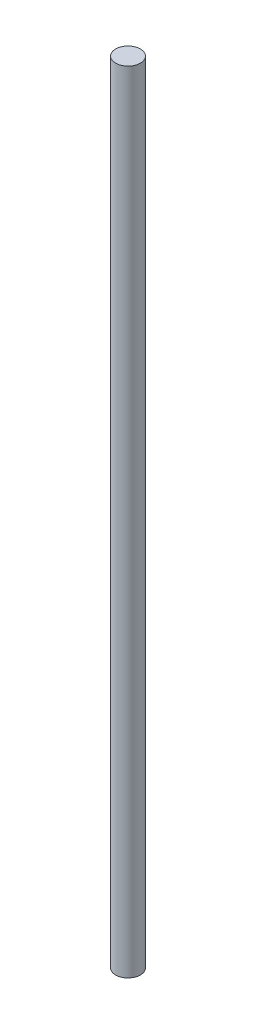
ISO-10303-21;
HEADER;
FILE_DESCRIPTION(('STEP AP214'),'2;1');
FILE_NAME('part.step','',(''),(''),'','','');
FILE_SCHEMA(('AUTOMOTIVE_DESIGN { 1 0 10303 214 1 1 1 1 }'));
ENDSEC;
DATA;
#1=APPLICATION_CONTEXT('core data for automotive mechanical design processes');
#2=APPLICATION_PROTOCOL_DEFINITION('international standard','automotive_design',2000,#1);
#3=PRODUCT_CONTEXT('',#1,'mechanical');
#4=PRODUCT('Part','Part','',(#3));
#5=PRODUCT_RELATED_PRODUCT_CATEGORY('part','',(#4));
#6=PRODUCT_DEFINITION_FORMATION('','',#4);
#7=PRODUCT_DEFINITION_CONTEXT('part definition',#1,'design');
#8=PRODUCT_DEFINITION('design','',#6,#7);
#9=PRODUCT_DEFINITION_SHAPE('','',#8);
#10=(LENGTH_UNIT() NAMED_UNIT(*) SI_UNIT(.MILLI.,.METRE.));
#11=(NAMED_UNIT(*) PLANE_ANGLE_UNIT() SI_UNIT($,.RADIAN.));
#12=(NAMED_UNIT(*) SI_UNIT($,.STERADIAN.) SOLID_ANGLE_UNIT());
#13=UNCERTAINTY_MEASURE_WITH_UNIT(LENGTH_MEASURE(1.E-05),#10,'distance_accuracy_value','');
#14=(GEOMETRIC_REPRESENTATION_CONTEXT(3) GLOBAL_UNCERTAINTY_ASSIGNED_CONTEXT((#13)) GLOBAL_UNIT_ASSIGNED_CONTEXT((#10,
#11,#12)) REPRESENTATION_CONTEXT('',''));
#15=CARTESIAN_POINT('',(0.,0.,0.));
#16=DIRECTION('',(0.,0.,1.));
#17=DIRECTION('',(1.,0.,0.));
#18=AXIS2_PLACEMENT_3D('',#15,#16,#17);
#19=CARTESIAN_POINT('',(0.,304.8,0.));
#20=DIRECTION('',(0.,-1.,0.));
#21=DIRECTION('',(0.,0.,-1.));
#22=AXIS2_PLACEMENT_3D('',#19,#20,#21);
#23=CYLINDRICAL_SURFACE('',#22,4.7625);
#24=CARTESIAN_POINT('',(0.,304.8,0.));
#25=DIRECTION('',(0.,1.,0.));
#26=DIRECTION('',(0.,0.,1.));
#27=AXIS2_PLACEMENT_3D('',#24,#25,#26);
#28=CIRCLE('',#27,4.7625);
#29=CARTESIAN_POINT('',(0.,304.8,-4.7625));
#30=VERTEX_POINT('',#29);
#31=EDGE_CURVE('E10',#30,#30,#28,.T.);
#32=CARTESIAN_POINT('',(0.,0.,0.));
#33=DIRECTION('',(0.,1.,0.));
#34=DIRECTION('',(0.,0.,1.));
#35=AXIS2_PLACEMENT_3D('',#32,#33,#34);
#36=CIRCLE('',#35,4.7625);
#37=CARTESIAN_POINT('',(0.,0.,-4.7625));
#38=VERTEX_POINT('',#37);
#39=EDGE_CURVE('E37',#38,#38,#36,.T.);
#40=CARTESIAN_POINT('',(0.,304.8,-4.7625));
#41=CARTESIAN_POINT('',(0.,301.625,-4.7625));
#42=CARTESIAN_POINT('',(0.,298.45,-4.7625));
#43=CARTESIAN_POINT('',(0.,292.1,-4.7625));
#44=CARTESIAN_POINT('',(0.,288.925,-4.7625));
#45=CARTESIAN_POINT('',(0.,282.575,-4.7625));
#46=CARTESIAN_POINT('',(0.,279.4,-4.7625));
#47=CARTESIAN_POINT('',(0.,273.05,-4.7625));
#48=CARTESIAN_POINT('',(0.,269.875,-4.7625));
#49=CARTESIAN_POINT('',(0.,263.525,-4.7625));
#50=CARTESIAN_POINT('',(0.,260.35,-4.7625));
#51=CARTESIAN_POINT('',(0.,254.,-4.7625));
#52=CARTESIAN_POINT('',(0.,250.825,-4.7625));
#53=CARTESIAN_POINT('',(0.,244.475,-4.7625));
#54=CARTESIAN_POINT('',(0.,241.3,-4.7625));
#55=CARTESIAN_POINT('',(0.,234.95,-4.7625));
#56=CARTESIAN_POINT('',(0.,231.775,-4.7625));
#57=CARTESIAN_POINT('',(0.,225.425,-4.7625));
#58=CARTESIAN_POINT('',(0.,222.25,-4.7625));
#59=CARTESIAN_POINT('',(0.,215.9,-4.7625));
#60=CARTESIAN_POINT('',(0.,212.725,-4.7625));
#61=CARTESIAN_POINT('',(0.,206.375,-4.7625));
#62=CARTESIAN_POINT('',(0.,203.2,-4.7625));
#63=CARTESIAN_POINT('',(0.,196.85,-4.7625));
#64=CARTESIAN_POINT('',(0.,193.675,-4.7625));
#65=CARTESIAN_POINT('',(0.,187.325,-4.7625));
#66=CARTESIAN_POINT('',(0.,184.15,-4.7625));
#67=CARTESIAN_POINT('',(0.,177.8,-4.7625));
#68=CARTESIAN_POINT('',(0.,174.625,-4.7625));
#69=CARTESIAN_POINT('',(0.,168.275,-4.7625));
#70=CARTESIAN_POINT('',(0.,165.1,-4.7625));
#71=CARTESIAN_POINT('',(0.,158.75,-4.7625));
#72=CARTESIAN_POINT('',(0.,155.575,-4.7625));
#73=CARTESIAN_POINT('',(0.,149.225,-4.7625));
#74=CARTESIAN_POINT('',(0.,146.05,-4.7625));
#75=CARTESIAN_POINT('',(0.,139.7,-4.7625));
#76=CARTESIAN_POINT('',(0.,136.525,-4.7625));
#77=CARTESIAN_POINT('',(0.,130.175,-4.7625));
#78=CARTESIAN_POINT('',(0.,127.,-4.7625));
#79=CARTESIAN_POINT('',(0.,120.65,-4.7625));
#80=CARTESIAN_POINT('',(0.,117.475,-4.7625));
#81=CARTESIAN_POINT('',(0.,111.125,-4.7625));
#82=CARTESIAN_POINT('',(0.,107.95,-4.7625));
#83=CARTESIAN_POINT('',(0.,101.6,-4.7625));
#84=CARTESIAN_POINT('',(0.,98.425,-4.7625));
#85=CARTESIAN_POINT('',(0.,92.075,-4.7625));
#86=CARTESIAN_POINT('',(0.,88.9,-4.7625));
#87=CARTESIAN_POINT('',(0.,82.55,-4.7625));
#88=CARTESIAN_POINT('',(0.,79.375,-4.7625));
#89=CARTESIAN_POINT('',(0.,73.025,-4.7625));
#90=CARTESIAN_POINT('',(0.,69.85,-4.7625));
#91=CARTESIAN_POINT('',(0.,63.5,-4.7625));
#92=CARTESIAN_POINT('',(0.,60.325,-4.7625));
#93=CARTESIAN_POINT('',(0.,53.975,-4.7625));
#94=CARTESIAN_POINT('',(0.,50.8,-4.7625));
#95=CARTESIAN_POINT('',(0.,44.45,-4.7625));
#96=CARTESIAN_POINT('',(0.,41.275,-4.7625));
#97=CARTESIAN_POINT('',(0.,34.925,-4.7625));
#98=CARTESIAN_POINT('',(0.,31.75,-4.7625));
#99=CARTESIAN_POINT('',(0.,25.4,-4.7625));
#100=CARTESIAN_POINT('',(0.,22.225,-4.7625));
#101=CARTESIAN_POINT('',(0.,15.875,-4.7625));
#102=CARTESIAN_POINT('',(0.,12.7,-4.7625));
#103=CARTESIAN_POINT('',(0.,6.35,-4.7625));
#104=CARTESIAN_POINT('',(0.,3.175,-4.7625));
#105=CARTESIAN_POINT('',(0.,0.,-4.7625));
#106=B_SPLINE_CURVE_WITH_KNOTS('',3,(#40,#41,#42,#43,#44,#45,#46,#47,#48,#49,#50,#51,#52,#53,
#54,#55,#56,#57,#58,#59,#60,#61,#62,#63,#64,#65,#66,#67,#68,#69,#70,#71,#72,#73,#74,#75,#76,#77,
#78,#79,#80,#81,#82,#83,#84,#85,#86,#87,#88,#89,#90,#91,#92,#93,#94,#95,#96,#97,#98,#99,#100,
#101,#102,#103,#104,#105),.UNSPECIFIED.,.F.,.F.,(4,2,2,2,2,2,2,2,2,2,2,2,2,2,2,2,2,2,2,2,2,2,2,
2,2,2,2,2,2,2,2,2,4),(0.,9.52499999999995,19.05,28.575,38.1,47.625,57.15,66.675,76.2,85.725,
95.2499999999999,104.775,114.3,123.825,133.35,142.875,152.4,161.925,171.45,180.975,190.5,
200.025,209.55,219.075,228.6,238.125,247.65,257.175,266.7,276.225,285.75,295.275,304.8),.UNSPECIFIED.);
#107=EDGE_CURVE('BSEAM40',#30,#38,#106,.T.);
#108=ORIENTED_EDGE('',*,*,#31,.F.);
#109=ORIENTED_EDGE('',*,*,#39,.T.);
#110=ORIENTED_EDGE('',*,*,#107,.T.);
#111=ORIENTED_EDGE('',*,*,#107,.F.);
#112=EDGE_LOOP('',(#108,#110,#109,#111));
#113=FACE_BOUND('',#112,.T.);
#114=ADVANCED_FACE('F40',(#113),#23,.T.);
#115=CARTESIAN_POINT('',(0.,304.8,0.));
#116=DIRECTION('',(0.,1.,0.));
#117=DIRECTION('',(0.,0.,1.));
#118=AXIS2_PLACEMENT_3D('',#115,#116,#117);
#119=PLANE('',#118);
#120=ORIENTED_EDGE('',*,*,#31,.T.);
#121=EDGE_LOOP('',(#120));
#122=FACE_BOUND('',#121,.T.);
#123=ADVANCED_FACE('F55',(#122),#119,.T.);
#124=CARTESIAN_POINT('',(0.,0.,0.));
#125=DIRECTION('',(0.,1.,0.));
#126=DIRECTION('',(0.,0.,1.));
#127=AXIS2_PLACEMENT_3D('',#124,#125,#126);
#128=PLANE('',#127);
#129=ORIENTED_EDGE('',*,*,#39,.F.);
#130=EDGE_LOOP('',(#129));
#131=FACE_BOUND('',#130,.T.);
#132=ADVANCED_FACE('F49',(#131),#128,.F.);
#133=CLOSED_SHELL('',(#114,#123,#132));
#134=MANIFOLD_SOLID_BREP('B2',#133);
#135=ADVANCED_BREP_SHAPE_REPRESENTATION('',(#18,#134),#14);
#136=SHAPE_DEFINITION_REPRESENTATION(#9,#135);
ENDSEC;
END-ISO-10303-21;
